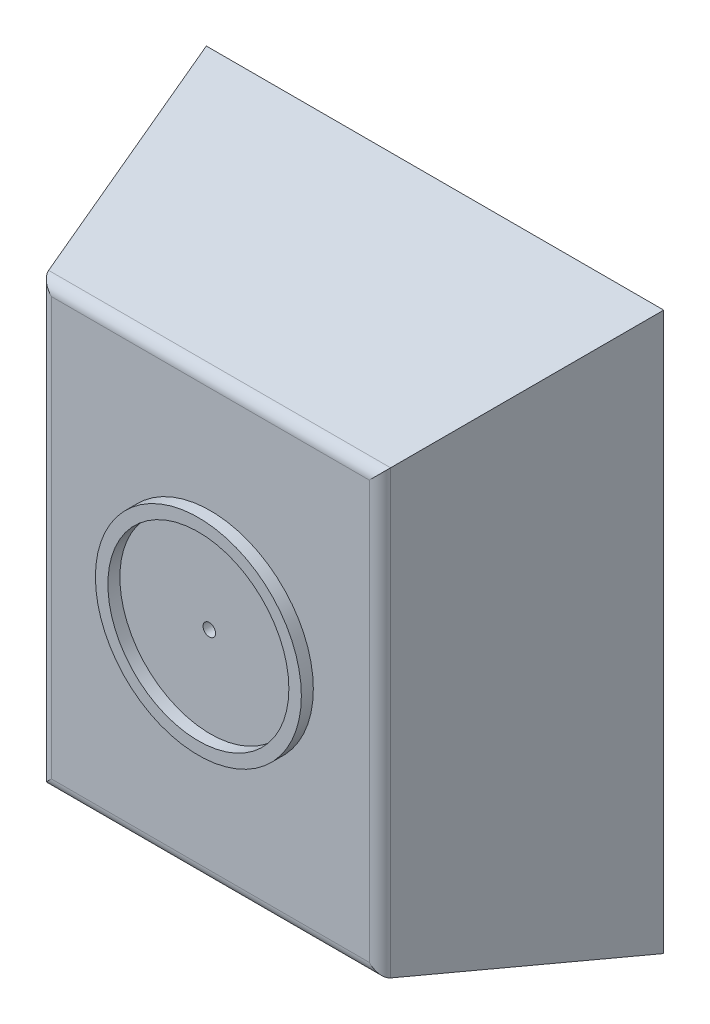
ISO-10303-21;
HEADER;
FILE_DESCRIPTION(('STEP AP214'),'2;1');
FILE_NAME('part.step','',(''),(''),'','','');
FILE_SCHEMA(('AUTOMOTIVE_DESIGN { 1 0 10303 214 1 1 1 1 }'));
ENDSEC;
DATA;
#1=APPLICATION_CONTEXT('core data for automotive mechanical design processes');
#2=APPLICATION_PROTOCOL_DEFINITION('international standard','automotive_design',2000,#1);
#3=PRODUCT_CONTEXT('',#1,'mechanical');
#4=PRODUCT('Part','Part','',(#3));
#5=PRODUCT_RELATED_PRODUCT_CATEGORY('part','',(#4));
#6=PRODUCT_DEFINITION_FORMATION('','',#4);
#7=PRODUCT_DEFINITION_CONTEXT('part definition',#1,'design');
#8=PRODUCT_DEFINITION('design','',#6,#7);
#9=PRODUCT_DEFINITION_SHAPE('','',#8);
#10=(LENGTH_UNIT() NAMED_UNIT(*) SI_UNIT(.MILLI.,.METRE.));
#11=(NAMED_UNIT(*) PLANE_ANGLE_UNIT() SI_UNIT($,.RADIAN.));
#12=(NAMED_UNIT(*) SI_UNIT($,.STERADIAN.) SOLID_ANGLE_UNIT());
#13=UNCERTAINTY_MEASURE_WITH_UNIT(LENGTH_MEASURE(1.E-05),#10,'distance_accuracy_value','');
#14=(GEOMETRIC_REPRESENTATION_CONTEXT(3) GLOBAL_UNCERTAINTY_ASSIGNED_CONTEXT((#13)) GLOBAL_UNIT_ASSIGNED_CONTEXT((#10,
#11,#12)) REPRESENTATION_CONTEXT('',''));
#15=CARTESIAN_POINT('',(0.,0.,0.));
#16=DIRECTION('',(0.,0.,1.));
#17=DIRECTION('',(1.,0.,0.));
#18=AXIS2_PLACEMENT_3D('',#15,#16,#17);
#19=CARTESIAN_POINT('',(67.5003244670998,87.5002244654349,51.5478369211786));
#20=DIRECTION('',(0.,0.,-1.));
#21=DIRECTION('',(-1.,0.,0.));
#22=AXIS2_PLACEMENT_3D('',#19,#20,#21);
#23=PLANE('',#22);
#24=DIRECTION('',(0.,1.,0.));
#25=VECTOR('',#24,1.);
#26=CARTESIAN_POINT('',(43.3848971482987,87.5002244654349,51.5478369211786));
#27=LINE('',#26,#25);
#28=CARTESIAN_POINT('',(43.3848971482987,286.615651784236,51.5478369211786));
#29=VERTEX_POINT('',#28);
#30=CARTESIAN_POINT('',(43.3848971482987,63.3847971466338,51.5478369211786));
#31=VERTEX_POINT('',#30);
#32=EDGE_CURVE('E169',#29,#31,#27,.F.);
#33=ORIENTED_EDGE('',*,*,#32,.F.);
#34=DIRECTION('',(1.,0.,0.));
#35=VECTOR('',#34,1.);
#36=CARTESIAN_POINT('',(67.5003244670998,286.615651784236,51.5478369211786));
#37=LINE('',#36,#35);
#38=CARTESIAN_POINT('',(226.615751785901,286.615651784236,51.5478369211786));
#39=VERTEX_POINT('',#38);
#40=EDGE_CURVE('E166',#39,#29,#37,.F.);
#41=ORIENTED_EDGE('',*,*,#40,.F.);
#42=DIRECTION('',(0.,-1.,0.));
#43=VECTOR('',#42,1.);
#44=CARTESIAN_POINT('',(226.615751785901,87.500224465435,51.5478369211786));
#45=LINE('',#44,#43);
#46=CARTESIAN_POINT('',(226.615751785901,63.3847971466338,51.5478369211786));
#47=VERTEX_POINT('',#46);
#48=EDGE_CURVE('E176',#47,#39,#45,.F.);
#49=ORIENTED_EDGE('',*,*,#48,.F.);
#50=DIRECTION('',(-1.,0.,0.));
#51=VECTOR('',#50,1.);
#52=CARTESIAN_POINT('',(67.5003244670998,63.3847971466338,51.5478369211786));
#53=LINE('',#52,#51);
#54=EDGE_CURVE('E172',#31,#47,#53,.F.);
#55=ORIENTED_EDGE('',*,*,#54,.F.);
#56=EDGE_LOOP('',(#33,#41,#49,#55));
#57=FACE_BOUND('',#56,.T.);
#58=DIRECTION('',(1.,0.,0.));
#59=VECTOR('',#58,1.);
#60=CARTESIAN_POINT('',(67.5003244670998,271.086509078085,51.5478369211786));
#61=LINE('',#60,#59);
#62=CARTESIAN_POINT('',(211.08660907975,271.086509078085,51.5478369211786));
#63=VERTEX_POINT('',#62);
#64=CARTESIAN_POINT('',(58.9140398544499,271.086509078085,51.5478369211786));
#65=VERTEX_POINT('',#64);
#66=EDGE_CURVE('E148',#63,#65,#61,.F.);
#67=ORIENTED_EDGE('',*,*,#66,.T.);
#68=DIRECTION('',(0.,1.,0.));
#69=VECTOR('',#68,1.);
#70=CARTESIAN_POINT('',(58.91403985445,87.5002244654349,51.5478369211786));
#71=LINE('',#70,#69);
#72=CARTESIAN_POINT('',(58.91403985445,78.9139398527851,51.5478369211786));
#73=VERTEX_POINT('',#72);
#74=EDGE_CURVE('E153',#65,#73,#71,.F.);
#75=ORIENTED_EDGE('',*,*,#74,.T.);
#76=DIRECTION('',(-1.,0.,0.));
#77=VECTOR('',#76,1.);
#78=CARTESIAN_POINT('',(67.5003244670998,78.9139398527851,51.5478369211786));
#79=LINE('',#78,#77);
#80=CARTESIAN_POINT('',(211.08660907975,78.9139398527851,51.5478369211786));
#81=VERTEX_POINT('',#80);
#82=EDGE_CURVE('E138',#73,#81,#79,.F.);
#83=ORIENTED_EDGE('',*,*,#82,.T.);
#84=DIRECTION('',(0.,-1.,0.));
#85=VECTOR('',#84,1.);
#86=CARTESIAN_POINT('',(211.08660907975,87.500224465435,51.5478369211786));
#87=LINE('',#86,#85);
#88=EDGE_CURVE('E52',#81,#63,#87,.F.);
#89=ORIENTED_EDGE('',*,*,#88,.T.);
#90=EDGE_LOOP('',(#67,#75,#83,#89));
#91=FACE_BOUND('',#90,.T.);
#92=ADVANCED_FACE('F37',(#57,#91),#23,.T.);
#93=CARTESIAN_POINT('',(67.5003244670998,87.5002244654349,141.547836921179));
#94=DIRECTION('',(-0.965925826289068,0.,0.258819045102521));
#95=DIRECTION('',(0.258819045102521,0.,0.965925826289068));
#96=AXIS2_PLACEMENT_3D('',#93,#94,#95);
#97=PLANE('',#96);
#98=DIRECTION('',(-0.250562807085732,-0.250562807085732,-0.935113126531029));
#99=VECTOR('',#98,1.);
#100=CARTESIAN_POINT('',(67.5003244670998,87.5002244654349,141.547836921179));
#101=LINE('',#100,#99);
#102=CARTESIAN_POINT('',(66.5073302755493,86.5072302738844,137.841932146691));
#103=VERTEX_POINT('',#102);
#104=EDGE_CURVE('E159',#103,#31,#101,.T.);
#105=ORIENTED_EDGE('',*,*,#104,.F.);
#106=DIRECTION('',(0.,-1.,0.));
#107=VECTOR('',#106,1.);
#108=CARTESIAN_POINT('',(66.5073302755493,87.5002244654349,137.841932146691));
#109=LINE('',#108,#107);
#110=CARTESIAN_POINT('',(66.5073302755492,263.493218656985,137.841932146691));
#111=VERTEX_POINT('',#110);
#112=EDGE_CURVE('E45',#103,#111,#109,.F.);
#113=ORIENTED_EDGE('',*,*,#112,.T.);
#114=DIRECTION('',(-0.250562807085732,0.250562807085732,-0.935113126531029));
#115=VECTOR('',#114,1.);
#116=CARTESIAN_POINT('',(78.4871255186691,251.513423413866,182.551136658286));
#117=LINE('',#116,#115);
#118=EDGE_CURVE('E163',#111,#29,#117,.T.);
#119=ORIENTED_EDGE('',*,*,#118,.T.);
#120=ORIENTED_EDGE('',*,*,#32,.T.);
#121=EDGE_LOOP('',(#105,#113,#119,#120));
#122=FACE_BOUND('',#121,.T.);
#123=ADVANCED_FACE('F218',(#122),#97,.T.);
#124=CARTESIAN_POINT('',(67.5003244670998,87.5002244654349,141.547836921179));
#125=DIRECTION('',(0.,-0.965925826289068,0.258819045102521));
#126=DIRECTION('',(0.,-0.258819045102521,-0.965925826289068));
#127=AXIS2_PLACEMENT_3D('',#124,#125,#126);
#128=PLANE('',#127);
#129=DIRECTION('',(0.250562807085732,-0.250562807085732,-0.935113126531029));
#130=VECTOR('',#129,1.);
#131=CARTESIAN_POINT('',(202.5003244671,87.5002244654349,141.547836921179));
#132=LINE('',#131,#130);
#133=CARTESIAN_POINT('',(203.49331865865,86.5072302738844,137.841932146691));
#134=VERTEX_POINT('',#133);
#135=EDGE_CURVE('E162',#134,#47,#132,.T.);
#136=ORIENTED_EDGE('',*,*,#135,.F.);
#137=DIRECTION('',(1.,0.,0.));
#138=VECTOR('',#137,1.);
#139=CARTESIAN_POINT('',(67.5003244670998,86.5072302738844,137.841932146691));
#140=LINE('',#139,#138);
#141=EDGE_CURVE('E60',#134,#103,#140,.F.);
#142=ORIENTED_EDGE('',*,*,#141,.T.);
#143=ORIENTED_EDGE('',*,*,#104,.T.);
#144=ORIENTED_EDGE('',*,*,#54,.T.);
#145=EDGE_LOOP('',(#136,#142,#143,#144));
#146=FACE_BOUND('',#145,.T.);
#147=ADVANCED_FACE('F252',(#146),#128,.T.);
#148=CARTESIAN_POINT('',(202.5003244671,87.5002244654349,141.547836921179));
#149=DIRECTION('',(0.965925826289068,0.,0.258819045102521));
#150=DIRECTION('',(0.258819045102521,0.,-0.965925826289068));
#151=AXIS2_PLACEMENT_3D('',#148,#149,#150);
#152=PLANE('',#151);
#153=DIRECTION('',(0.250562807085732,0.250562807085732,-0.935113126531029));
#154=VECTOR('',#153,1.);
#155=CARTESIAN_POINT('',(194.024792227318,254.024692225653,173.178953861233));
#156=LINE('',#155,#154);
#157=CARTESIAN_POINT('',(203.49331865865,263.493218656986,137.841932146691));
#158=VERTEX_POINT('',#157);
#159=EDGE_CURVE('E165',#158,#39,#156,.T.);
#160=ORIENTED_EDGE('',*,*,#159,.F.);
#161=DIRECTION('',(0.,1.,0.));
#162=VECTOR('',#161,1.);
#163=CARTESIAN_POINT('',(203.49331865865,87.5002244654349,137.841932146691));
#164=LINE('',#163,#162);
#165=EDGE_CURVE('E192',#158,#134,#164,.F.);
#166=ORIENTED_EDGE('',*,*,#165,.T.);
#167=ORIENTED_EDGE('',*,*,#135,.T.);
#168=ORIENTED_EDGE('',*,*,#48,.T.);
#169=EDGE_LOOP('',(#160,#166,#167,#168));
#170=FACE_BOUND('',#169,.T.);
#171=ADVANCED_FACE('F238',(#170),#152,.T.);
#172=CARTESIAN_POINT('',(67.5003244670998,262.500224465435,141.547836921179));
#173=DIRECTION('',(0.,0.965925826289068,0.258819045102521));
#174=DIRECTION('',(0.,-0.258819045102521,0.965925826289068));
#175=AXIS2_PLACEMENT_3D('',#172,#173,#174);
#176=PLANE('',#175);
#177=ORIENTED_EDGE('',*,*,#118,.F.);
#178=DIRECTION('',(-1.,0.,0.));
#179=VECTOR('',#178,1.);
#180=CARTESIAN_POINT('',(67.5003244670998,263.493218656986,137.841932146691));
#181=LINE('',#180,#179);
#182=EDGE_CURVE('E189',#111,#158,#181,.F.);
#183=ORIENTED_EDGE('',*,*,#182,.T.);
#184=ORIENTED_EDGE('',*,*,#159,.T.);
#185=ORIENTED_EDGE('',*,*,#40,.T.);
#186=EDGE_LOOP('',(#177,#183,#184,#185));
#187=FACE_BOUND('',#186,.T.);
#188=ADVANCED_FACE('F221',(#187),#176,.T.);
#189=CARTESIAN_POINT('',(67.5003244670998,87.5002244654349,141.547836921179));
#190=DIRECTION('',(0.,0.,-1.));
#191=DIRECTION('',(-1.,0.,0.));
#192=AXIS2_PLACEMENT_3D('',#189,#190,#191);
#193=PLANE('',#192);
#194=CARTESIAN_POINT('',(135.0003244671,175.000224465435,141.547836921179));
#195=DIRECTION('',(0.,0.,-1.));
#196=DIRECTION('',(-1.,0.,0.));
#197=AXIS2_PLACEMENT_3D('',#194,#195,#196);
#198=CIRCLE('',#197,41.25);
#199=CARTESIAN_POINT('',(93.7503244670998,175.000224465435,141.547836921179));
#200=VERTEX_POINT('',#199);
#201=EDGE_CURVE('E11',#200,#200,#198,.F.);
#202=ORIENTED_EDGE('',*,*,#201,.F.);
#203=EDGE_LOOP('',(#202));
#204=FACE_BOUND('',#203,.T.);
#205=DIRECTION('',(0.,-1.,0.));
#206=VECTOR('',#205,1.);
#207=CARTESIAN_POINT('',(198.663689527205,87.500224465435,141.547836921179));
#208=LINE('',#207,#206);
#209=CARTESIAN_POINT('',(198.663689527205,91.3368594053297,141.547836921179));
#210=VERTEX_POINT('',#209);
#211=CARTESIAN_POINT('',(198.663689527205,258.66358952554,141.547836921179));
#212=VERTEX_POINT('',#211);
#213=EDGE_CURVE('E184',#210,#212,#208,.F.);
#214=ORIENTED_EDGE('',*,*,#213,.T.);
#215=DIRECTION('',(1.,0.,0.));
#216=VECTOR('',#215,1.);
#217=CARTESIAN_POINT('',(67.5003244670998,258.66358952554,141.547836921179));
#218=LINE('',#217,#216);
#219=CARTESIAN_POINT('',(71.3369594069946,258.66358952554,141.547836921179));
#220=VERTEX_POINT('',#219);
#221=EDGE_CURVE('E186',#212,#220,#218,.F.);
#222=ORIENTED_EDGE('',*,*,#221,.T.);
#223=DIRECTION('',(0.,1.,0.));
#224=VECTOR('',#223,1.);
#225=CARTESIAN_POINT('',(71.3369594069946,87.5002244654349,141.547836921179));
#226=LINE('',#225,#224);
#227=CARTESIAN_POINT('',(71.3369594069946,91.3368594053297,141.547836921179));
#228=VERTEX_POINT('',#227);
#229=EDGE_CURVE('E161',#220,#228,#226,.F.);
#230=ORIENTED_EDGE('',*,*,#229,.T.);
#231=DIRECTION('',(-1.,0.,0.));
#232=VECTOR('',#231,1.);
#233=CARTESIAN_POINT('',(67.5003244670998,91.3368594053297,141.547836921179));
#234=LINE('',#233,#232);
#235=EDGE_CURVE('E182',#228,#210,#234,.F.);
#236=ORIENTED_EDGE('',*,*,#235,.T.);
#237=EDGE_LOOP('',(#214,#222,#230,#236));
#238=FACE_BOUND('',#237,.T.);
#239=ADVANCED_FACE('F229',(#204,#238),#193,.F.);
#240=CARTESIAN_POINT('',(67.5003244670998,91.3368594053297,136.547836921179));
#241=DIRECTION('',(-1.,0.,0.));
#242=DIRECTION('',(0.,0.,1.));
#243=AXIS2_PLACEMENT_3D('',#240,#241,#242);
#244=CYLINDRICAL_SURFACE('',#243,5.);
#245=CARTESIAN_POINT('',(71.3369594069946,91.3368594053297,136.547836921179));
#246=DIRECTION('',(-0.707106781186548,0.707106781186547,0.));
#247=DIRECTION('',(0.707106781186547,0.707106781186548,0.));
#248=AXIS2_PLACEMENT_3D('',#245,#246,#247);
#249=ELLIPSE('',#248,7.07106781186547,5.);
#250=EDGE_CURVE('E199',#103,#228,#249,.T.);
#251=ORIENTED_EDGE('',*,*,#250,.F.);
#252=ORIENTED_EDGE('',*,*,#141,.F.);
#253=CARTESIAN_POINT('',(198.663689527205,91.3368594053297,136.547836921179));
#254=DIRECTION('',(-0.707106781186547,-0.707106781186548,0.));
#255=DIRECTION('',(-0.707106781186548,0.707106781186547,0.));
#256=AXIS2_PLACEMENT_3D('',#253,#254,#255);
#257=ELLIPSE('',#256,7.07106781186548,5.);
#258=EDGE_CURVE('E173',#210,#134,#257,.F.);
#259=ORIENTED_EDGE('',*,*,#258,.F.);
#260=ORIENTED_EDGE('',*,*,#235,.F.);
#261=EDGE_LOOP('',(#251,#252,#259,#260));
#262=FACE_BOUND('',#261,.T.);
#263=ADVANCED_FACE('F39',(#262),#244,.T.);
#264=CARTESIAN_POINT('',(198.663689527205,87.500224465435,136.547836921179));
#265=DIRECTION('',(0.,-1.,0.));
#266=DIRECTION('',(1.,0.,0.));
#267=AXIS2_PLACEMENT_3D('',#264,#265,#266);
#268=CYLINDRICAL_SURFACE('',#267,5.);
#269=ORIENTED_EDGE('',*,*,#258,.T.);
#270=ORIENTED_EDGE('',*,*,#165,.F.);
#271=CARTESIAN_POINT('',(198.663689527205,258.66358952554,136.547836921179));
#272=DIRECTION('',(0.707106781186548,-0.707106781186547,0.));
#273=DIRECTION('',(-0.707106781186547,-0.707106781186548,0.));
#274=AXIS2_PLACEMENT_3D('',#271,#272,#273);
#275=ELLIPSE('',#274,7.07106781186547,5.);
#276=EDGE_CURVE('E197',#212,#158,#275,.F.);
#277=ORIENTED_EDGE('',*,*,#276,.F.);
#278=ORIENTED_EDGE('',*,*,#213,.F.);
#279=EDGE_LOOP('',(#269,#270,#277,#278));
#280=FACE_BOUND('',#279,.T.);
#281=ADVANCED_FACE('F206',(#280),#268,.T.);
#282=CARTESIAN_POINT('',(71.3369594069946,87.5002244654349,136.547836921179));
#283=DIRECTION('',(0.,1.,0.));
#284=DIRECTION('',(-1.,0.,0.));
#285=AXIS2_PLACEMENT_3D('',#282,#283,#284);
#286=CYLINDRICAL_SURFACE('',#285,5.);
#287=ORIENTED_EDGE('',*,*,#250,.T.);
#288=ORIENTED_EDGE('',*,*,#229,.F.);
#289=CARTESIAN_POINT('',(71.3369594069946,258.66358952554,136.547836921179));
#290=DIRECTION('',(0.707106781186547,0.707106781186548,0.));
#291=DIRECTION('',(-0.707106781186548,0.707106781186547,0.));
#292=AXIS2_PLACEMENT_3D('',#289,#290,#291);
#293=ELLIPSE('',#292,7.07106781186548,5.);
#294=EDGE_CURVE('E134',#111,#220,#293,.T.);
#295=ORIENTED_EDGE('',*,*,#294,.F.);
#296=ORIENTED_EDGE('',*,*,#112,.F.);
#297=EDGE_LOOP('',(#287,#288,#295,#296));
#298=FACE_BOUND('',#297,.T.);
#299=ADVANCED_FACE('F215',(#298),#286,.T.);
#300=CARTESIAN_POINT('',(67.5003244670998,258.66358952554,136.547836921179));
#301=DIRECTION('',(1.,0.,0.));
#302=DIRECTION('',(0.,0.,-1.));
#303=AXIS2_PLACEMENT_3D('',#300,#301,#302);
#304=CYLINDRICAL_SURFACE('',#303,5.);
#305=ORIENTED_EDGE('',*,*,#276,.T.);
#306=ORIENTED_EDGE('',*,*,#182,.F.);
#307=ORIENTED_EDGE('',*,*,#294,.T.);
#308=ORIENTED_EDGE('',*,*,#221,.F.);
#309=EDGE_LOOP('',(#305,#306,#307,#308));
#310=FACE_BOUND('',#309,.T.);
#311=ADVANCED_FACE('F226',(#310),#304,.T.);
#312=CARTESIAN_POINT('',(81.9892118614358,87.5002244654349,137.665551244641));
#313=DIRECTION('',(-0.965925826289068,0.,0.258819045102521));
#314=DIRECTION('',(0.258819045102521,0.,0.965925826289068));
#315=AXIS2_PLACEMENT_3D('',#312,#313,#314);
#316=PLANE('',#315);
#317=DIRECTION('',(-0.250562807085732,-0.250562807085732,-0.935113126531029));
#318=VECTOR('',#317,1.);
#319=CARTESIAN_POINT('',(81.0795745856635,101.079474583999,134.270738715));
#320=LINE('',#319,#318);
#321=CARTESIAN_POINT('',(79.0102292867842,99.0101292851193,126.547836921179));
#322=VERTEX_POINT('',#321);
#323=EDGE_CURVE('E120',#322,#73,#320,.T.);
#324=ORIENTED_EDGE('',*,*,#323,.T.);
#325=ORIENTED_EDGE('',*,*,#74,.F.);
#326=DIRECTION('',(-0.250562807085732,0.250562807085732,-0.935113126531029));
#327=VECTOR('',#326,1.);
#328=CARTESIAN_POINT('',(92.0663756372328,237.934173295302,175.274038452108));
#329=LINE('',#328,#327);
#330=CARTESIAN_POINT('',(79.0102292867842,250.990319645751,126.547836921179));
#331=VERTEX_POINT('',#330);
#332=EDGE_CURVE('E122',#331,#65,#329,.T.);
#333=ORIENTED_EDGE('',*,*,#332,.F.);
#334=DIRECTION('',(0.,1.,0.));
#335=VECTOR('',#334,1.);
#336=CARTESIAN_POINT('',(79.0102292867842,87.5002244654349,126.547836921179));
#337=LINE('',#336,#335);
#338=EDGE_CURVE('E115',#331,#322,#337,.F.);
#339=ORIENTED_EDGE('',*,*,#338,.T.);
#340=EDGE_LOOP('',(#324,#325,#333,#339));
#341=FACE_BOUND('',#340,.T.);
#342=ADVANCED_FACE('F117',(#341),#316,.F.);
#343=CARTESIAN_POINT('',(67.5003244670998,101.989111859771,137.665551244641));
#344=DIRECTION('',(0.,-0.965925826289068,0.258819045102521));
#345=DIRECTION('',(0.,-0.258819045102521,-0.965925826289068));
#346=AXIS2_PLACEMENT_3D('',#343,#344,#345);
#347=PLANE('',#346);
#348=DIRECTION('',(0.250562807085732,-0.250562807085732,-0.935113126531029));
#349=VECTOR('',#348,1.);
#350=CARTESIAN_POINT('',(188.921074348536,101.079474583999,134.270738715));
#351=LINE('',#350,#349);
#352=CARTESIAN_POINT('',(190.990419647415,99.0101292851193,126.547836921179));
#353=VERTEX_POINT('',#352);
#354=EDGE_CURVE('E140',#353,#81,#351,.T.);
#355=ORIENTED_EDGE('',*,*,#354,.T.);
#356=ORIENTED_EDGE('',*,*,#82,.F.);
#357=ORIENTED_EDGE('',*,*,#323,.F.);
#358=DIRECTION('',(1.,0.,0.));
#359=VECTOR('',#358,1.);
#360=CARTESIAN_POINT('',(67.5003244670998,99.0101292851193,126.547836921179));
#361=LINE('',#360,#359);
#362=EDGE_CURVE('E129',#353,#322,#361,.F.);
#363=ORIENTED_EDGE('',*,*,#362,.F.);
#364=EDGE_LOOP('',(#355,#356,#357,#363));
#365=FACE_BOUND('',#364,.T.);
#366=ADVANCED_FACE('F136',(#365),#347,.F.);
#367=CARTESIAN_POINT('',(188.011437072764,87.5002244654349,137.665551244641));
#368=DIRECTION('',(0.965925826289068,0.,0.258819045102521));
#369=DIRECTION('',(0.258819045102521,0.,-0.965925826289068));
#370=AXIS2_PLACEMENT_3D('',#367,#368,#369);
#371=PLANE('',#370);
#372=DIRECTION('',(0.250562807085732,0.250562807085732,-0.935113126531029));
#373=VECTOR('',#372,1.);
#374=CARTESIAN_POINT('',(180.445542108754,240.445442107089,165.901855655054));
#375=LINE('',#374,#373);
#376=CARTESIAN_POINT('',(190.990419647415,250.990319645751,126.547836921179));
#377=VERTEX_POINT('',#376);
#378=EDGE_CURVE('E142',#377,#63,#375,.T.);
#379=ORIENTED_EDGE('',*,*,#378,.T.);
#380=ORIENTED_EDGE('',*,*,#88,.F.);
#381=ORIENTED_EDGE('',*,*,#354,.F.);
#382=DIRECTION('',(0.,1.,0.));
#383=VECTOR('',#382,1.);
#384=CARTESIAN_POINT('',(190.990419647415,87.5002244654349,126.547836921179));
#385=LINE('',#384,#383);
#386=EDGE_CURVE('E132',#377,#353,#385,.F.);
#387=ORIENTED_EDGE('',*,*,#386,.F.);
#388=EDGE_LOOP('',(#379,#380,#381,#387));
#389=FACE_BOUND('',#388,.T.);
#390=ADVANCED_FACE('F289',(#389),#371,.F.);
#391=CARTESIAN_POINT('',(67.5003244670998,248.011337071099,137.665551244641));
#392=DIRECTION('',(0.,0.965925826289068,0.258819045102521));
#393=DIRECTION('',(0.,-0.258819045102521,0.965925826289068));
#394=AXIS2_PLACEMENT_3D('',#391,#392,#393);
#395=PLANE('',#394);
#396=ORIENTED_EDGE('',*,*,#332,.T.);
#397=ORIENTED_EDGE('',*,*,#66,.F.);
#398=ORIENTED_EDGE('',*,*,#378,.F.);
#399=DIRECTION('',(-1.,0.,0.));
#400=VECTOR('',#399,1.);
#401=CARTESIAN_POINT('',(67.5003244670998,250.990319645751,126.547836921179));
#402=LINE('',#401,#400);
#403=EDGE_CURVE('E125',#331,#377,#402,.F.);
#404=ORIENTED_EDGE('',*,*,#403,.F.);
#405=EDGE_LOOP('',(#396,#397,#398,#404));
#406=FACE_BOUND('',#405,.T.);
#407=ADVANCED_FACE('F296',(#406),#395,.F.);
#408=CARTESIAN_POINT('',(67.5003244670998,87.5002244654349,126.547836921179));
#409=DIRECTION('',(0.,0.,-1.));
#410=DIRECTION('',(-1.,0.,0.));
#411=AXIS2_PLACEMENT_3D('',#408,#409,#410);
#412=PLANE('',#411);
#413=CARTESIAN_POINT('',(134.575070049576,174.706034645228,126.547836921179));
#414=DIRECTION('',(0.,0.,-1.));
#415=DIRECTION('',(-1.,0.,0.));
#416=AXIS2_PLACEMENT_3D('',#413,#414,#415);
#417=CIRCLE('',#416,2.5);
#418=CARTESIAN_POINT('',(132.075070049576,174.706034645228,126.547836921179));
#419=VERTEX_POINT('',#418);
#420=EDGE_CURVE('E361',#419,#419,#417,.T.);
#421=ORIENTED_EDGE('',*,*,#420,.F.);
#422=EDGE_LOOP('',(#421));
#423=FACE_BOUND('',#422,.T.);
#424=ORIENTED_EDGE('',*,*,#386,.T.);
#425=ORIENTED_EDGE('',*,*,#362,.T.);
#426=ORIENTED_EDGE('',*,*,#338,.F.);
#427=ORIENTED_EDGE('',*,*,#403,.T.);
#428=EDGE_LOOP('',(#424,#425,#426,#427));
#429=FACE_BOUND('',#428,.T.);
#430=ADVANCED_FACE('F130',(#423,#429),#412,.T.);
#431=CARTESIAN_POINT('',(135.0003244671,175.000224465435,146.347836921179));
#432=DIRECTION('',(0.,0.,1.));
#433=DIRECTION('',(1.,0.,0.));
#434=AXIS2_PLACEMENT_3D('',#431,#432,#433);
#435=PLANE('',#434);
#436=CARTESIAN_POINT('',(135.0003244671,175.000224465435,146.347836921179));
#437=DIRECTION('',(0.,0.,1.));
#438=DIRECTION('',(1.,0.,0.));
#439=AXIS2_PLACEMENT_3D('',#436,#437,#438);
#440=CIRCLE('',#439,41.25);
#441=CARTESIAN_POINT('',(176.2503244671,175.000224465435,146.347836921179));
#442=VERTEX_POINT('',#441);
#443=EDGE_CURVE('E145',#442,#442,#440,.T.);
#444=ORIENTED_EDGE('',*,*,#443,.T.);
#445=EDGE_LOOP('',(#444));
#446=FACE_BOUND('',#445,.T.);
#447=CARTESIAN_POINT('',(135.0003244671,175.000224465435,146.347836921179));
#448=DIRECTION('',(0.,0.,1.));
#449=DIRECTION('',(1.,0.,0.));
#450=AXIS2_PLACEMENT_3D('',#447,#448,#449);
#451=CIRCLE('',#450,36.25);
#452=CARTESIAN_POINT('',(171.2503244671,175.000224465435,146.347836921179));
#453=VERTEX_POINT('',#452);
#454=EDGE_CURVE('E366',#453,#453,#451,.T.);
#455=ORIENTED_EDGE('',*,*,#454,.F.);
#456=EDGE_LOOP('',(#455));
#457=FACE_BOUND('',#456,.T.);
#458=ADVANCED_FACE('F310',(#446,#457),#435,.T.);
#459=CARTESIAN_POINT('',(135.0003244671,175.000224465435,146.347836921179));
#460=DIRECTION('',(0.,0.,-1.));
#461=DIRECTION('',(-1.,0.,0.));
#462=AXIS2_PLACEMENT_3D('',#459,#460,#461);
#463=CYLINDRICAL_SURFACE('',#462,41.25);
#464=ORIENTED_EDGE('',*,*,#443,.F.);
#465=EDGE_LOOP('',(#464));
#466=FACE_BOUND('',#465,.T.);
#467=ORIENTED_EDGE('',*,*,#201,.T.);
#468=EDGE_LOOP('',(#467));
#469=FACE_BOUND('',#468,.T.);
#470=ADVANCED_FACE('F318',(#466,#469),#463,.T.);
#471=CARTESIAN_POINT('',(135.0003244671,175.000224465435,146.347836921179));
#472=DIRECTION('',(0.,0.,-1.));
#473=DIRECTION('',(-1.,0.,0.));
#474=AXIS2_PLACEMENT_3D('',#471,#472,#473);
#475=CYLINDRICAL_SURFACE('',#474,36.25);
#476=ORIENTED_EDGE('',*,*,#454,.T.);
#477=EDGE_LOOP('',(#476));
#478=FACE_BOUND('',#477,.T.);
#479=CARTESIAN_POINT('',(135.0003244671,175.000224465435,141.547836921179));
#480=DIRECTION('',(0.,0.,1.));
#481=DIRECTION('',(1.,0.,0.));
#482=AXIS2_PLACEMENT_3D('',#479,#480,#481);
#483=CIRCLE('',#482,36.25);
#484=CARTESIAN_POINT('',(171.2503244671,175.000224465435,141.547836921179));
#485=VERTEX_POINT('',#484);
#486=EDGE_CURVE('E363',#485,#485,#483,.T.);
#487=ORIENTED_EDGE('',*,*,#486,.F.);
#488=EDGE_LOOP('',(#487));
#489=FACE_BOUND('',#488,.T.);
#490=ADVANCED_FACE('F245',(#478,#489),#475,.F.);
#491=CARTESIAN_POINT('',(134.575070049576,174.706034645228,141.547836921179));
#492=DIRECTION('',(0.,0.,-1.));
#493=DIRECTION('',(-1.,0.,0.));
#494=AXIS2_PLACEMENT_3D('',#491,#492,#493);
#495=CIRCLE('',#494,2.5);
#496=CARTESIAN_POINT('',(132.075070049576,174.706034645228,141.547836921179));
#497=VERTEX_POINT('',#496);
#498=EDGE_CURVE('E358',#497,#497,#495,.F.);
#499=ORIENTED_EDGE('',*,*,#498,.F.);
#500=EDGE_LOOP('',(#499));
#501=FACE_BOUND('',#500,.T.);
#502=ORIENTED_EDGE('',*,*,#486,.T.);
#503=EDGE_LOOP('',(#502));
#504=FACE_BOUND('',#503,.T.);
#505=ADVANCED_FACE('F233',(#501,#504),#193,.F.);
#506=CARTESIAN_POINT('',(134.575070049576,174.706034645228,148.618904733044));
#507=DIRECTION('',(0.,0.,-1.));
#508=DIRECTION('',(-1.,0.,0.));
#509=AXIS2_PLACEMENT_3D('',#506,#507,#508);
#510=CYLINDRICAL_SURFACE('',#509,2.5);
#511=ORIENTED_EDGE('',*,*,#498,.T.);
#512=EDGE_LOOP('',(#511));
#513=FACE_BOUND('',#512,.T.);
#514=ORIENTED_EDGE('',*,*,#420,.T.);
#515=EDGE_LOOP('',(#514));
#516=FACE_BOUND('',#515,.T.);
#517=ADVANCED_FACE('F244',(#513,#516),#510,.F.);
#518=CLOSED_SHELL('',(#92,#123,#147,#171,#188,#239,#263,#281,#299,#311,#342,#366,#390,#407,#430,
#458,#470,#490,#505,#517));
#519=MANIFOLD_SOLID_BREP('B2',#518);
#520=ADVANCED_BREP_SHAPE_REPRESENTATION('',(#18,#519),#14);
#521=SHAPE_DEFINITION_REPRESENTATION(#9,#520);
ENDSEC;
END-ISO-10303-21;
